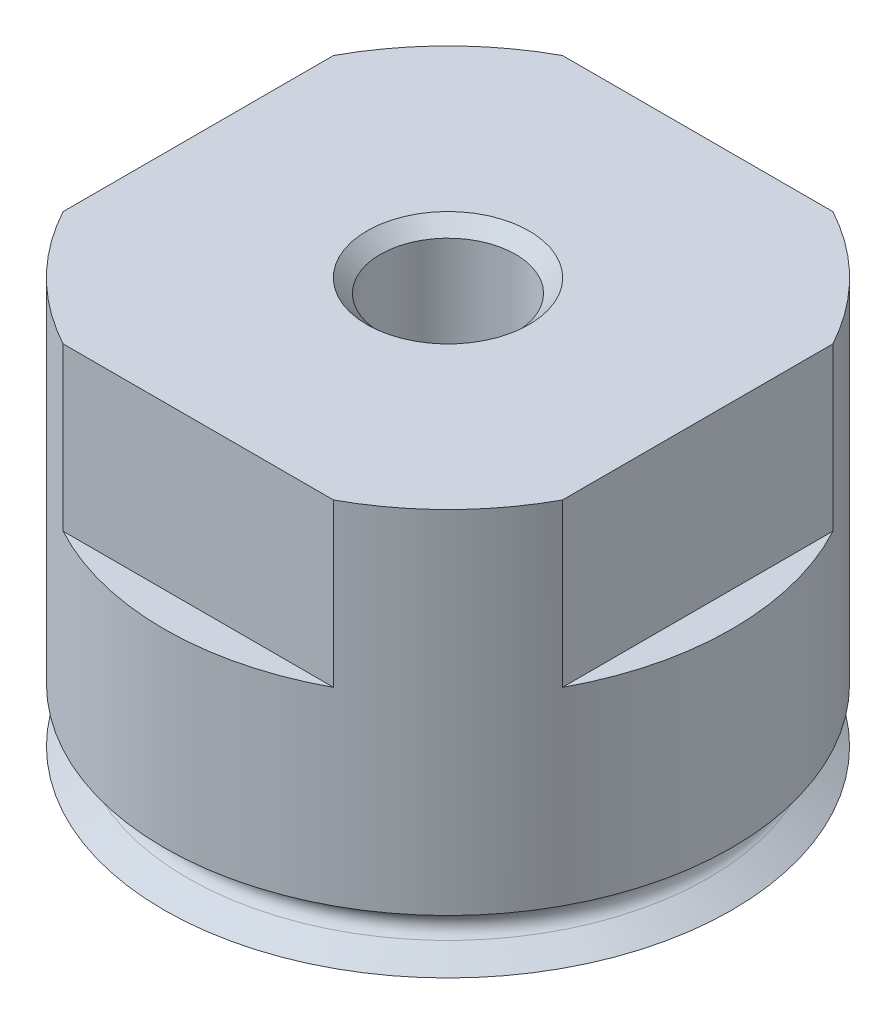
ISO-10303-21;
HEADER;
FILE_DESCRIPTION(('STEP AP214'),'2;1');
FILE_NAME('part.step','',(''),(''),'','','');
FILE_SCHEMA(('AUTOMOTIVE_DESIGN { 1 0 10303 214 1 1 1 1 }'));
ENDSEC;
DATA;
#1=APPLICATION_CONTEXT('core data for automotive mechanical design processes');
#2=APPLICATION_PROTOCOL_DEFINITION('international standard','automotive_design',2000,#1);
#3=PRODUCT_CONTEXT('',#1,'mechanical');
#4=PRODUCT('Part','Part','',(#3));
#5=PRODUCT_RELATED_PRODUCT_CATEGORY('part','',(#4));
#6=PRODUCT_DEFINITION_FORMATION('','',#4);
#7=PRODUCT_DEFINITION_CONTEXT('part definition',#1,'design');
#8=PRODUCT_DEFINITION('design','',#6,#7);
#9=PRODUCT_DEFINITION_SHAPE('','',#8);
#10=(LENGTH_UNIT() NAMED_UNIT(*) SI_UNIT(.MILLI.,.METRE.));
#11=(NAMED_UNIT(*) PLANE_ANGLE_UNIT() SI_UNIT($,.RADIAN.));
#12=(NAMED_UNIT(*) SI_UNIT($,.STERADIAN.) SOLID_ANGLE_UNIT());
#13=UNCERTAINTY_MEASURE_WITH_UNIT(LENGTH_MEASURE(1.E-05),#10,'distance_accuracy_value','');
#14=(GEOMETRIC_REPRESENTATION_CONTEXT(3) GLOBAL_UNCERTAINTY_ASSIGNED_CONTEXT((#13)) GLOBAL_UNIT_ASSIGNED_CONTEXT((#10,
#11,#12)) REPRESENTATION_CONTEXT('',''));
#15=CARTESIAN_POINT('',(0.,0.,0.));
#16=DIRECTION('',(0.,0.,1.));
#17=DIRECTION('',(1.,0.,0.));
#18=AXIS2_PLACEMENT_3D('',#15,#16,#17);
#19=CARTESIAN_POINT('',(0.,4.263945741691,0.));
#20=DIRECTION('',(0.,1.,0.));
#21=DIRECTION('',(1.,0.,0.));
#22=AXIS2_PLACEMENT_3D('',#19,#20,#21);
#23=CONICAL_SURFACE('',#22,1.275,1.02974425867665);
#24=DIRECTION('',(-0.857167300702112,0.515038074910054,0.));
#25=VECTOR('',#24,1.);
#26=CARTESIAN_POINT('',(-1.275,4.263945741691,0.));
#27=LINE('',#26,#25);
#28=CARTESIAN_POINT('',(0.,3.497848452431,0.));
#29=VERTEX_POINT('',#28);
#30=CARTESIAN_POINT('',(-2.5,5.,0.));
#31=VERTEX_POINT('',#30);
#32=EDGE_CURVE('E11',#29,#31,#27,.T.);
#33=ORIENTED_EDGE('',*,*,#32,.T.);
#34=CARTESIAN_POINT('',(0.,5.,0.));
#35=DIRECTION('',(0.,-1.,0.));
#36=DIRECTION('',(1.,0.,0.));
#37=AXIS2_PLACEMENT_3D('',#34,#35,#36);
#38=CIRCLE('',#37,2.5);
#39=EDGE_CURVE('E236',#31,#31,#38,.T.);
#40=ORIENTED_EDGE('',*,*,#39,.F.);
#41=ORIENTED_EDGE('',*,*,#32,.F.);
#42=EDGE_LOOP('',(#33,#40,#41));
#43=FACE_BOUND('',#42,.T.);
#44=ADVANCED_FACE('F17',(#43),#23,.F.);
#45=CARTESIAN_POINT('',(0.,2.922740875053,0.));
#46=DIRECTION('',(0.,1.,0.));
#47=DIRECTION('',(1.,0.,0.));
#48=AXIS2_PLACEMENT_3D('',#45,#46,#47);
#49=CYLINDRICAL_SURFACE('',#48,2.5);
#50=ORIENTED_EDGE('',*,*,#39,.T.);
#51=DIRECTION('',(0.,1.,0.));
#52=VECTOR('',#51,1.);
#53=CARTESIAN_POINT('',(-2.5,2.922740875053,0.));
#54=LINE('',#53,#52);
#55=CARTESIAN_POINT('',(-2.5,14.5,0.));
#56=VERTEX_POINT('',#55);
#57=EDGE_CURVE('E27',#31,#56,#54,.T.);
#58=ORIENTED_EDGE('',*,*,#57,.T.);
#59=CARTESIAN_POINT('',(0.,14.5,0.));
#60=DIRECTION('',(0.,-1.,0.));
#61=DIRECTION('',(-1.,0.,0.));
#62=AXIS2_PLACEMENT_3D('',#59,#60,#61);
#63=CIRCLE('',#62,2.5);
#64=CARTESIAN_POINT('',(0.,14.499999999998,2.500000000002));
#65=VERTEX_POINT('',#64);
#66=EDGE_CURVE('E206',#65,#56,#63,.T.);
#67=ORIENTED_EDGE('',*,*,#66,.F.);
#68=CARTESIAN_POINT('',(0.,14.5,0.));
#69=DIRECTION('',(0.,-1.,0.));
#70=DIRECTION('',(-1.,0.,0.));
#71=AXIS2_PLACEMENT_3D('',#68,#69,#70);
#72=CIRCLE('',#71,2.5);
#73=EDGE_CURVE('E194',#56,#65,#72,.T.);
#74=ORIENTED_EDGE('',*,*,#73,.F.);
#75=ORIENTED_EDGE('',*,*,#57,.F.);
#76=EDGE_LOOP('',(#50,#58,#67,#74,#75));
#77=FACE_BOUND('',#76,.T.);
#78=ADVANCED_FACE('F449',(#77),#49,.F.);
#79=CARTESIAN_POINT('',(0.,14.74999999924,0.));
#80=DIRECTION('',(0.,1.,0.));
#81=DIRECTION('',(0.,0.,-1.));
#82=AXIS2_PLACEMENT_3D('',#79,#80,#81);
#83=CONICAL_SURFACE('',#82,2.749999999244,0.785398163397448);
#84=ORIENTED_EDGE('',*,*,#73,.T.);
#85=DIRECTION('',(0.,0.707106781186548,0.707106781186548));
#86=VECTOR('',#85,1.);
#87=CARTESIAN_POINT('',(0.,14.74999999924,2.749999999244));
#88=LINE('',#87,#86);
#89=CARTESIAN_POINT('',(0.,14.999999999998,3.000000000002));
#90=VERTEX_POINT('',#89);
#91=EDGE_CURVE('E198',#65,#90,#88,.T.);
#92=ORIENTED_EDGE('',*,*,#91,.T.);
#93=CARTESIAN_POINT('',(0.,15.,0.));
#94=DIRECTION('',(0.,-1.,0.));
#95=DIRECTION('',(-1.,0.,0.));
#96=AXIS2_PLACEMENT_3D('',#93,#94,#95);
#97=CIRCLE('',#96,3.);
#98=EDGE_CURVE('E199',#90,#90,#97,.T.);
#99=ORIENTED_EDGE('',*,*,#98,.F.);
#100=ORIENTED_EDGE('',*,*,#91,.F.);
#101=ORIENTED_EDGE('',*,*,#66,.T.);
#102=EDGE_LOOP('',(#84,#92,#99,#100,#101));
#103=FACE_BOUND('',#102,.T.);
#104=ADVANCED_FACE('F439',(#103),#83,.F.);
#105=CARTESIAN_POINT('',(5.,15.,9.23309265631));
#106=DIRECTION('',(0.,0.,-1.));
#107=DIRECTION('',(0.,-1.,0.));
#108=AXIS2_PLACEMENT_3D('',#105,#106,#107);
#109=PLANE('',#108);
#110=DIRECTION('',(-1.,0.,0.));
#111=VECTOR('',#110,1.);
#112=CARTESIAN_POINT('',(5.,15.,9.23309265631));
#113=LINE('',#112,#111);
#114=CARTESIAN_POINT('',(5.,15.,9.23309265631));
#115=VERTEX_POINT('',#114);
#116=CARTESIAN_POINT('',(-5.,15.,9.23309265631));
#117=VERTEX_POINT('',#116);
#118=EDGE_CURVE('E265',#115,#117,#113,.T.);
#119=ORIENTED_EDGE('',*,*,#118,.T.);
#120=DIRECTION('',(2.439530059443E-11,1.,0.));
#121=VECTOR('',#120,1.);
#122=CARTESIAN_POINT('',(-5.000000000146,9.,9.23309265631));
#123=LINE('',#122,#121);
#124=CARTESIAN_POINT('',(-5.00000000034,9.,9.233092656126));
#125=VERTEX_POINT('',#124);
#126=EDGE_CURVE('E272',#125,#117,#123,.T.);
#127=ORIENTED_EDGE('',*,*,#126,.F.);
#128=DIRECTION('',(-1.,0.,0.));
#129=VECTOR('',#128,1.);
#130=CARTESIAN_POINT('',(5.000000000146,9.,9.23309265631));
#131=LINE('',#130,#129);
#132=CARTESIAN_POINT('',(5.00000000034,9.,9.233092656126));
#133=VERTEX_POINT('',#132);
#134=EDGE_CURVE('E248',#133,#125,#131,.T.);
#135=ORIENTED_EDGE('',*,*,#134,.F.);
#136=DIRECTION('',(-2.439530059443E-11,1.,0.));
#137=VECTOR('',#136,1.);
#138=CARTESIAN_POINT('',(5.000000000146,9.,9.23309265631));
#139=LINE('',#138,#137);
#140=EDGE_CURVE('E168',#133,#115,#139,.T.);
#141=ORIENTED_EDGE('',*,*,#140,.T.);
#142=EDGE_LOOP('',(#119,#127,#135,#141));
#143=FACE_BOUND('',#142,.T.);
#144=ADVANCED_FACE('F430',(#143),#109,.F.);
#145=CARTESIAN_POINT('',(9.23309265631,15.,-5.));
#146=DIRECTION('',(-1.,0.,0.));
#147=DIRECTION('',(0.,0.,1.));
#148=AXIS2_PLACEMENT_3D('',#145,#146,#147);
#149=PLANE('',#148);
#150=DIRECTION('',(0.,1.,-7.135225743582E-11));
#151=VECTOR('',#150,1.);
#152=CARTESIAN_POINT('',(9.23309265631,9.,-4.999999999572));
#153=LINE('',#152,#151);
#154=CARTESIAN_POINT('',(9.233092656847,9.,-4.999999999007));
#155=VERTEX_POINT('',#154);
#156=CARTESIAN_POINT('',(9.23309265631,15.,-5.));
#157=VERTEX_POINT('',#156);
#158=EDGE_CURVE('E210',#155,#157,#153,.T.);
#159=ORIENTED_EDGE('',*,*,#158,.T.);
#160=DIRECTION('',(0.,0.,1.));
#161=VECTOR('',#160,1.);
#162=CARTESIAN_POINT('',(9.23309265631,15.,-5.));
#163=LINE('',#162,#161);
#164=CARTESIAN_POINT('',(9.23309265631,15.,5.));
#165=VERTEX_POINT('',#164);
#166=EDGE_CURVE('E262',#157,#165,#163,.T.);
#167=ORIENTED_EDGE('',*,*,#166,.T.);
#168=DIRECTION('',(0.,1.,7.135240546556E-11));
#169=VECTOR('',#168,1.);
#170=CARTESIAN_POINT('',(9.23309265631,9.,4.999999999572));
#171=LINE('',#170,#169);
#172=CARTESIAN_POINT('',(9.233092656847,9.,4.999999999007));
#173=VERTEX_POINT('',#172);
#174=EDGE_CURVE('E219',#173,#165,#171,.T.);
#175=ORIENTED_EDGE('',*,*,#174,.F.);
#176=DIRECTION('',(0.,0.,1.));
#177=VECTOR('',#176,1.);
#178=CARTESIAN_POINT('',(9.23309265631,9.,-4.999999999572));
#179=LINE('',#178,#177);
#180=EDGE_CURVE('E182',#155,#173,#179,.T.);
#181=ORIENTED_EDGE('',*,*,#180,.F.);
#182=EDGE_LOOP('',(#159,#167,#175,#181));
#183=FACE_BOUND('',#182,.T.);
#184=ADVANCED_FACE('F282',(#183),#149,.F.);
#185=CARTESIAN_POINT('',(-5.,15.,-9.23309265631));
#186=DIRECTION('',(0.,0.,1.));
#187=DIRECTION('',(1.,0.,0.));
#188=AXIS2_PLACEMENT_3D('',#185,#186,#187);
#189=PLANE('',#188);
#190=DIRECTION('',(-2.439589271338E-11,1.,0.));
#191=VECTOR('',#190,1.);
#192=CARTESIAN_POINT('',(5.000000000146,9.,-9.23309265631));
#193=LINE('',#192,#191);
#194=CARTESIAN_POINT('',(5.00000000034,9.,-9.233092656126));
#195=VERTEX_POINT('',#194);
#196=CARTESIAN_POINT('',(5.,15.,-9.23309265631));
#197=VERTEX_POINT('',#196);
#198=EDGE_CURVE('E21',#195,#197,#193,.T.);
#199=ORIENTED_EDGE('',*,*,#198,.F.);
#200=DIRECTION('',(1.,0.,0.));
#201=VECTOR('',#200,1.);
#202=CARTESIAN_POINT('',(-5.000000000146,9.,-9.23309265631));
#203=LINE('',#202,#201);
#204=CARTESIAN_POINT('',(-5.00000000034,9.,-9.233092656126));
#205=VERTEX_POINT('',#204);
#206=EDGE_CURVE('E186',#205,#195,#203,.T.);
#207=ORIENTED_EDGE('',*,*,#206,.F.);
#208=DIRECTION('',(2.439589271338E-11,1.,0.));
#209=VECTOR('',#208,1.);
#210=CARTESIAN_POINT('',(-5.000000000146,9.,-9.23309265631));
#211=LINE('',#210,#209);
#212=CARTESIAN_POINT('',(-5.,15.,-9.23309265631));
#213=VERTEX_POINT('',#212);
#214=EDGE_CURVE('E175',#205,#213,#211,.T.);
#215=ORIENTED_EDGE('',*,*,#214,.T.);
#216=DIRECTION('',(1.,0.,0.));
#217=VECTOR('',#216,1.);
#218=CARTESIAN_POINT('',(-5.,15.,-9.23309265631));
#219=LINE('',#218,#217);
#220=EDGE_CURVE('E254',#213,#197,#219,.T.);
#221=ORIENTED_EDGE('',*,*,#220,.T.);
#222=EDGE_LOOP('',(#199,#207,#215,#221));
#223=FACE_BOUND('',#222,.T.);
#224=ADVANCED_FACE('F429',(#223),#189,.F.);
#225=CARTESIAN_POINT('',(0.,15.,0.));
#226=DIRECTION('',(0.,1.,0.));
#227=DIRECTION('',(1.,0.,0.));
#228=AXIS2_PLACEMENT_3D('',#225,#226,#227);
#229=PLANE('',#228);
#230=ORIENTED_EDGE('',*,*,#98,.T.);
#231=EDGE_LOOP('',(#230));
#232=FACE_BOUND('',#231,.T.);
#233=ORIENTED_EDGE('',*,*,#220,.F.);
#234=CARTESIAN_POINT('',(0.,15.,0.));
#235=DIRECTION('',(0.,1.,0.));
#236=DIRECTION('',(-0.476190476190486,0.,-0.879342157743775));
#237=AXIS2_PLACEMENT_3D('',#234,#235,#236);
#238=CIRCLE('',#237,10.5);
#239=CARTESIAN_POINT('',(-9.23309265631,15.,-5.));
#240=VERTEX_POINT('',#239);
#241=EDGE_CURVE('E171',#213,#240,#238,.T.);
#242=ORIENTED_EDGE('',*,*,#241,.T.);
#243=DIRECTION('',(0.,0.,-1.));
#244=VECTOR('',#243,1.);
#245=CARTESIAN_POINT('',(-9.23309265631,15.,5.));
#246=LINE('',#245,#244);
#247=CARTESIAN_POINT('',(-9.23309265631,15.,5.));
#248=VERTEX_POINT('',#247);
#249=EDGE_CURVE('E251',#248,#240,#246,.T.);
#250=ORIENTED_EDGE('',*,*,#249,.F.);
#251=CARTESIAN_POINT('',(0.,15.,0.));
#252=DIRECTION('',(0.,-1.,0.));
#253=DIRECTION('',(-0.476190476190486,0.,0.879342157743775));
#254=AXIS2_PLACEMENT_3D('',#251,#252,#253);
#255=CIRCLE('',#254,10.5);
#256=EDGE_CURVE('E229',#117,#248,#255,.T.);
#257=ORIENTED_EDGE('',*,*,#256,.F.);
#258=ORIENTED_EDGE('',*,*,#118,.F.);
#259=CARTESIAN_POINT('',(0.,15.,0.));
#260=DIRECTION('',(0.,-1.,0.));
#261=DIRECTION('',(0.879342157743775,0.,0.476190476190486));
#262=AXIS2_PLACEMENT_3D('',#259,#260,#261);
#263=CIRCLE('',#262,10.5);
#264=EDGE_CURVE('E223',#165,#115,#263,.T.);
#265=ORIENTED_EDGE('',*,*,#264,.F.);
#266=ORIENTED_EDGE('',*,*,#166,.F.);
#267=CARTESIAN_POINT('',(0.,15.,0.));
#268=DIRECTION('',(0.,1.,0.));
#269=DIRECTION('',(0.879342157743775,0.,-0.476190476190486));
#270=AXIS2_PLACEMENT_3D('',#267,#268,#269);
#271=CIRCLE('',#270,10.5);
#272=EDGE_CURVE('E215',#157,#197,#271,.T.);
#273=ORIENTED_EDGE('',*,*,#272,.T.);
#274=EDGE_LOOP('',(#233,#242,#250,#257,#258,#265,#266,#273));
#275=FACE_BOUND('',#274,.T.);
#276=ADVANCED_FACE('F291',(#232,#275),#229,.T.);
#277=CARTESIAN_POINT('',(-9.23309265631,15.,5.));
#278=DIRECTION('',(1.,0.,0.));
#279=DIRECTION('',(0.,1.,0.));
#280=AXIS2_PLACEMENT_3D('',#277,#278,#279);
#281=PLANE('',#280);
#282=DIRECTION('',(0.,1.,-7.13513692574E-11));
#283=VECTOR('',#282,1.);
#284=CARTESIAN_POINT('',(-9.23309265631,9.,-4.999999999572));
#285=LINE('',#284,#283);
#286=CARTESIAN_POINT('',(-9.233092656847,9.,-4.999999999007));
#287=VERTEX_POINT('',#286);
#288=EDGE_CURVE('E176',#287,#240,#285,.T.);
#289=ORIENTED_EDGE('',*,*,#288,.F.);
#290=DIRECTION('',(0.,0.,-1.));
#291=VECTOR('',#290,1.);
#292=CARTESIAN_POINT('',(-9.23309265631,9.,4.999999999572));
#293=LINE('',#292,#291);
#294=CARTESIAN_POINT('',(-9.233092656847,9.,4.999999999007));
#295=VERTEX_POINT('',#294);
#296=EDGE_CURVE('E245',#295,#287,#293,.T.);
#297=ORIENTED_EDGE('',*,*,#296,.F.);
#298=DIRECTION('',(0.,1.,7.135151728714E-11));
#299=VECTOR('',#298,1.);
#300=CARTESIAN_POINT('',(-9.23309265631,9.,4.999999999572));
#301=LINE('',#300,#299);
#302=EDGE_CURVE('E224',#295,#248,#301,.T.);
#303=ORIENTED_EDGE('',*,*,#302,.T.);
#304=ORIENTED_EDGE('',*,*,#249,.T.);
#305=EDGE_LOOP('',(#289,#297,#303,#304));
#306=FACE_BOUND('',#305,.T.);
#307=ADVANCED_FACE('F309',(#306),#281,.F.);
#308=CARTESIAN_POINT('',(0.,9.,0.));
#309=DIRECTION('',(0.,1.,0.));
#310=DIRECTION('',(1.,0.,0.));
#311=AXIS2_PLACEMENT_3D('',#308,#309,#310);
#312=PLANE('',#311);
#313=CARTESIAN_POINT('',(0.,9.,0.));
#314=DIRECTION('',(0.,1.,0.));
#315=DIRECTION('',(-0.47619047622279,0.,0.879342157726282));
#316=AXIS2_PLACEMENT_3D('',#313,#314,#315);
#317=CIRCLE('',#316,10.5);
#318=EDGE_CURVE('E268',#125,#133,#317,.T.);
#319=ORIENTED_EDGE('',*,*,#318,.T.);
#320=ORIENTED_EDGE('',*,*,#134,.T.);
#321=EDGE_LOOP('',(#319,#320));
#322=FACE_BOUND('',#321,.T.);
#323=ADVANCED_FACE('F19',(#322),#312,.T.);
#324=CARTESIAN_POINT('',(0.,9.,0.));
#325=DIRECTION('',(0.,1.,0.));
#326=DIRECTION('',(1.,0.,0.));
#327=AXIS2_PLACEMENT_3D('',#324,#325,#326);
#328=PLANE('',#327);
#329=CARTESIAN_POINT('',(0.,9.,0.));
#330=DIRECTION('',(0.,1.,0.));
#331=DIRECTION('',(-0.879342157794997,0.,-0.476190476095898));
#332=AXIS2_PLACEMENT_3D('',#329,#330,#331);
#333=CIRCLE('',#332,10.5);
#334=CARTESIAN_POINT('',(-10.5,9.,0.));
#335=VERTEX_POINT('',#334);
#336=EDGE_CURVE('E200',#287,#335,#333,.T.);
#337=ORIENTED_EDGE('',*,*,#336,.T.);
#338=CARTESIAN_POINT('',(0.,9.,0.));
#339=DIRECTION('',(0.,1.,0.));
#340=DIRECTION('',(-0.879342157794997,0.,-0.476190476095898));
#341=AXIS2_PLACEMENT_3D('',#338,#339,#340);
#342=CIRCLE('',#341,10.5);
#343=EDGE_CURVE('E228',#335,#295,#342,.T.);
#344=ORIENTED_EDGE('',*,*,#343,.T.);
#345=ORIENTED_EDGE('',*,*,#296,.T.);
#346=EDGE_LOOP('',(#337,#344,#345));
#347=FACE_BOUND('',#346,.T.);
#348=ADVANCED_FACE('F314',(#347),#328,.T.);
#349=CARTESIAN_POINT('',(0.,9.,0.));
#350=DIRECTION('',(0.,1.,0.));
#351=DIRECTION('',(1.,0.,0.));
#352=AXIS2_PLACEMENT_3D('',#349,#350,#351);
#353=PLANE('',#352);
#354=CARTESIAN_POINT('',(0.,9.,0.));
#355=DIRECTION('',(0.,1.,0.));
#356=DIRECTION('',(0.47619047622279,0.,-0.879342157726282));
#357=AXIS2_PLACEMENT_3D('',#354,#355,#356);
#358=CIRCLE('',#357,10.5);
#359=EDGE_CURVE('E190',#195,#205,#358,.T.);
#360=ORIENTED_EDGE('',*,*,#359,.T.);
#361=ORIENTED_EDGE('',*,*,#206,.T.);
#362=EDGE_LOOP('',(#360,#361));
#363=FACE_BOUND('',#362,.T.);
#364=ADVANCED_FACE('F414',(#363),#353,.T.);
#365=CARTESIAN_POINT('',(0.,9.,0.));
#366=DIRECTION('',(0.,1.,0.));
#367=DIRECTION('',(1.,0.,0.));
#368=AXIS2_PLACEMENT_3D('',#365,#366,#367);
#369=PLANE('',#368);
#370=CARTESIAN_POINT('',(0.,9.,0.));
#371=DIRECTION('',(0.,1.,0.));
#372=DIRECTION('',(1.,0.,0.));
#373=AXIS2_PLACEMENT_3D('',#370,#371,#372);
#374=CIRCLE('',#373,10.5);
#375=EDGE_CURVE('E214',#173,#155,#374,.T.);
#376=ORIENTED_EDGE('',*,*,#375,.T.);
#377=ORIENTED_EDGE('',*,*,#180,.T.);
#378=EDGE_LOOP('',(#376,#377));
#379=FACE_BOUND('',#378,.T.);
#380=ADVANCED_FACE('F300',(#379),#369,.T.);
#381=CARTESIAN_POINT('',(0.,-0.75,0.));
#382=DIRECTION('',(0.,1.,0.));
#383=DIRECTION('',(1.,0.,0.));
#384=AXIS2_PLACEMENT_3D('',#381,#382,#383);
#385=CYLINDRICAL_SURFACE('',#384,10.5);
#386=ORIENTED_EDGE('',*,*,#336,.F.);
#387=ORIENTED_EDGE('',*,*,#288,.T.);
#388=ORIENTED_EDGE('',*,*,#241,.F.);
#389=ORIENTED_EDGE('',*,*,#214,.F.);
#390=ORIENTED_EDGE('',*,*,#359,.F.);
#391=ORIENTED_EDGE('',*,*,#198,.T.);
#392=ORIENTED_EDGE('',*,*,#272,.F.);
#393=ORIENTED_EDGE('',*,*,#158,.F.);
#394=ORIENTED_EDGE('',*,*,#375,.F.);
#395=ORIENTED_EDGE('',*,*,#174,.T.);
#396=ORIENTED_EDGE('',*,*,#264,.T.);
#397=ORIENTED_EDGE('',*,*,#140,.F.);
#398=ORIENTED_EDGE('',*,*,#318,.F.);
#399=ORIENTED_EDGE('',*,*,#126,.T.);
#400=ORIENTED_EDGE('',*,*,#256,.T.);
#401=ORIENTED_EDGE('',*,*,#302,.F.);
#402=ORIENTED_EDGE('',*,*,#343,.F.);
#403=DIRECTION('',(0.,-1.,0.));
#404=VECTOR('',#403,1.);
#405=CARTESIAN_POINT('',(-10.5,-0.75,0.));
#406=LINE('',#405,#404);
#407=CARTESIAN_POINT('',(-10.5,2.,0.));
#408=VERTEX_POINT('',#407);
#409=EDGE_CURVE('E187',#335,#408,#406,.T.);
#410=ORIENTED_EDGE('',*,*,#409,.T.);
#411=CARTESIAN_POINT('',(0.,2.,0.));
#412=DIRECTION('',(0.,-1.,0.));
#413=DIRECTION('',(1.,0.,0.));
#414=AXIS2_PLACEMENT_3D('',#411,#412,#413);
#415=CIRCLE('',#414,10.5);
#416=EDGE_CURVE('E177',#408,#408,#415,.T.);
#417=ORIENTED_EDGE('',*,*,#416,.F.);
#418=ORIENTED_EDGE('',*,*,#409,.F.);
#419=EDGE_LOOP('',(#386,#387,#388,#389,#390,#391,#392,#393,#394,#395,#396,#397,#398,#399,#400,
#401,#402,#410,#417,#418));
#420=FACE_BOUND('',#419,.T.);
#421=ADVANCED_FACE('F298',(#420),#385,.T.);
#422=CARTESIAN_POINT('',(0.,1.708012573584,0.));
#423=DIRECTION('',(0.,1.,0.));
#424=DIRECTION('',(1.,0.,0.));
#425=AXIS2_PLACEMENT_3D('',#422,#423,#424);
#426=CONICAL_SURFACE('',#425,10.06201886038,0.982793723247326);
#427=ORIENTED_EDGE('',*,*,#416,.T.);
#428=DIRECTION('',(0.832050294337842,-0.554700196225232,0.));
#429=VECTOR('',#428,1.);
#430=CARTESIAN_POINT('',(-10.06201886038,1.708012573584,0.));
#431=LINE('',#430,#429);
#432=CARTESIAN_POINT('',(-9.62403772075439,1.41602514716692,0.));
#433=VERTEX_POINT('',#432);
#434=EDGE_CURVE('E181',#408,#433,#431,.T.);
#435=ORIENTED_EDGE('',*,*,#434,.T.);
#436=CARTESIAN_POINT('',(0.,1.416025147169,0.));
#437=DIRECTION('',(0.,-1.,0.));
#438=DIRECTION('',(1.,0.,0.));
#439=AXIS2_PLACEMENT_3D('',#436,#437,#438);
#440=CIRCLE('',#439,9.624037720753);
#441=CARTESIAN_POINT('',(-9.6239152353171,1.416025147169,0.0485550605818861));
#442=VERTEX_POINT('',#441);
#443=EDGE_CURVE('E150',#442,#433,#440,.T.);
#444=ORIENTED_EDGE('',*,*,#443,.F.);
#445=CARTESIAN_POINT('',(0.,1.416025147169,0.));
#446=DIRECTION('',(0.,-1.,0.));
#447=DIRECTION('',(1.,0.,0.));
#448=AXIS2_PLACEMENT_3D('',#445,#446,#447);
#449=CIRCLE('',#448,9.624037720753);
#450=EDGE_CURVE('E148',#433,#442,#449,.T.);
#451=ORIENTED_EDGE('',*,*,#450,.F.);
#452=ORIENTED_EDGE('',*,*,#434,.F.);
#453=EDGE_LOOP('',(#427,#435,#444,#451,#452));
#454=FACE_BOUND('',#453,.T.);
#455=ADVANCED_FACE('F474',(#454),#426,.T.);
#456=CARTESIAN_POINT('',(0.,1.,0.));
#457=DIRECTION('',(0.,1.,0.));
#458=DIRECTION('',(0.999987272968014,0.,-0.00504518602178607));
#459=AXIS2_PLACEMENT_3D('',#456,#457,#458);
#460=TOROIDAL_SURFACE('',#459,9.901387818866,0.5);
#461=ORIENTED_EDGE('',*,*,#450,.T.);
#462=CARTESIAN_POINT('',(-9.90126180358653,1.,0.0499543434200268));
#463=DIRECTION('',(-0.00504518602178619,0.,-0.999987272968014));
#464=DIRECTION('',(-0.999987272968014,0.,0.00504518602178619));
#465=AXIS2_PLACEMENT_3D('',#462,#463,#464);
#466=CIRCLE('',#465,0.5);
#467=CARTESIAN_POINT('',(-9.6239152353171,0.5839748528311,0.0485550605818861));
#468=VERTEX_POINT('',#467);
#469=EDGE_CURVE('E140',#442,#468,#466,.T.);
#470=ORIENTED_EDGE('',*,*,#469,.T.);
#471=CARTESIAN_POINT('',(0.,0.5839748528311,0.));
#472=DIRECTION('',(0.,-1.,0.));
#473=DIRECTION('',(1.,0.,0.));
#474=AXIS2_PLACEMENT_3D('',#471,#472,#473);
#475=CIRCLE('',#474,9.624037720753);
#476=CARTESIAN_POINT('',(9.624037720753,0.5839748528311,0.));
#477=VERTEX_POINT('',#476);
#478=EDGE_CURVE('E144',#477,#468,#475,.T.);
#479=ORIENTED_EDGE('',*,*,#478,.F.);
#480=CARTESIAN_POINT('',(0.,0.5839748528311,0.));
#481=DIRECTION('',(0.,-1.,0.));
#482=DIRECTION('',(1.,0.,0.));
#483=AXIS2_PLACEMENT_3D('',#480,#481,#482);
#484=CIRCLE('',#483,9.624037720753);
#485=EDGE_CURVE('E152',#468,#477,#484,.T.);
#486=ORIENTED_EDGE('',*,*,#485,.F.);
#487=ORIENTED_EDGE('',*,*,#469,.F.);
#488=ORIENTED_EDGE('',*,*,#443,.T.);
#489=EDGE_LOOP('',(#461,#470,#479,#486,#487,#488));
#490=FACE_BOUND('',#489,.T.);
#491=ADVANCED_FACE('F142',(#490),#460,.F.);
#492=CARTESIAN_POINT('',(0.,0.2919874264155,0.));
#493=DIRECTION('',(0.,-1.,0.));
#494=DIRECTION('',(-1.,0.,0.));
#495=AXIS2_PLACEMENT_3D('',#492,#493,#494);
#496=CONICAL_SURFACE('',#495,10.06201886038,0.982793723247326);
#497=CARTESIAN_POINT('',(0.,0.,0.));
#498=DIRECTION('',(0.,-1.,0.));
#499=DIRECTION('',(1.,0.,0.));
#500=AXIS2_PLACEMENT_3D('',#497,#498,#499);
#501=CIRCLE('',#500,10.5);
#502=CARTESIAN_POINT('',(10.5,0.,0.));
#503=VERTEX_POINT('',#502);
#504=EDGE_CURVE('E165',#503,#503,#501,.T.);
#505=ORIENTED_EDGE('',*,*,#504,.F.);
#506=DIRECTION('',(-0.832050294337842,0.554700196225232,0.));
#507=VECTOR('',#506,1.);
#508=CARTESIAN_POINT('',(10.06201886038,0.2919874264155,0.));
#509=LINE('',#508,#507);
#510=EDGE_CURVE('E158',#503,#477,#509,.T.);
#511=ORIENTED_EDGE('',*,*,#510,.T.);
#512=ORIENTED_EDGE('',*,*,#478,.T.);
#513=ORIENTED_EDGE('',*,*,#485,.T.);
#514=ORIENTED_EDGE('',*,*,#510,.F.);
#515=EDGE_LOOP('',(#505,#511,#512,#513,#514));
#516=FACE_BOUND('',#515,.T.);
#517=ADVANCED_FACE('F157',(#516),#496,.T.);
#518=CARTESIAN_POINT('',(0.,0.,0.));
#519=DIRECTION('',(0.,1.,0.));
#520=DIRECTION('',(1.,0.,0.));
#521=AXIS2_PLACEMENT_3D('',#518,#519,#520);
#522=PLANE('',#521);
#523=ORIENTED_EDGE('',*,*,#504,.T.);
#524=EDGE_LOOP('',(#523));
#525=FACE_BOUND('',#524,.T.);
#526=ADVANCED_FACE('F350',(#525),#522,.F.);
#527=CLOSED_SHELL('',(#44,#78,#104,#144,#184,#224,#276,#307,#323,#348,#364,#380,#421,#455,#491,
#517,#526));
#528=MANIFOLD_SOLID_BREP('B1',#527);
#529=ADVANCED_BREP_SHAPE_REPRESENTATION('',(#18,#528),#14);
#530=SHAPE_DEFINITION_REPRESENTATION(#9,#529);
ENDSEC;
END-ISO-10303-21;
